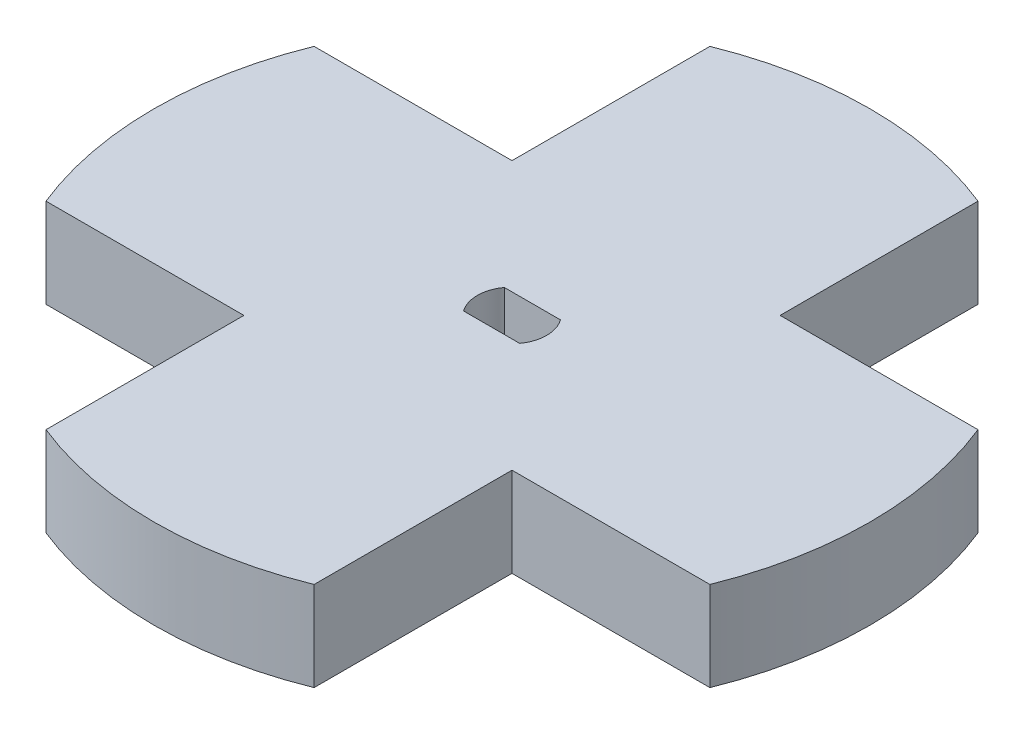
ISO-10303-21;
HEADER;
FILE_DESCRIPTION(('STEP AP214'),'2;1');
FILE_NAME('part.step','',(''),(''),'','','');
FILE_SCHEMA(('AUTOMOTIVE_DESIGN { 1 0 10303 214 1 1 1 1 }'));
ENDSEC;
DATA;
#1=APPLICATION_CONTEXT('core data for automotive mechanical design processes');
#2=APPLICATION_PROTOCOL_DEFINITION('international standard','automotive_design',2000,#1);
#3=PRODUCT_CONTEXT('',#1,'mechanical');
#4=PRODUCT('Part','Part','',(#3));
#5=PRODUCT_RELATED_PRODUCT_CATEGORY('part','',(#4));
#6=PRODUCT_DEFINITION_FORMATION('','',#4);
#7=PRODUCT_DEFINITION_CONTEXT('part definition',#1,'design');
#8=PRODUCT_DEFINITION('design','',#6,#7);
#9=PRODUCT_DEFINITION_SHAPE('','',#8);
#10=(LENGTH_UNIT() NAMED_UNIT(*) SI_UNIT(.MILLI.,.METRE.));
#11=(NAMED_UNIT(*) PLANE_ANGLE_UNIT() SI_UNIT($,.RADIAN.));
#12=(NAMED_UNIT(*) SI_UNIT($,.STERADIAN.) SOLID_ANGLE_UNIT());
#13=UNCERTAINTY_MEASURE_WITH_UNIT(LENGTH_MEASURE(1.E-05),#10,'distance_accuracy_value','');
#14=(GEOMETRIC_REPRESENTATION_CONTEXT(3) GLOBAL_UNCERTAINTY_ASSIGNED_CONTEXT((#13)) GLOBAL_UNIT_ASSIGNED_CONTEXT((#10,
#11,#12)) REPRESENTATION_CONTEXT('',''));
#15=CARTESIAN_POINT('',(0.,0.,0.));
#16=DIRECTION('',(0.,0.,1.));
#17=DIRECTION('',(1.,0.,0.));
#18=AXIS2_PLACEMENT_3D('',#15,#16,#17);
#19=CARTESIAN_POINT('',(11.6539635308884,6.35,-34.3590993755502));
#20=DIRECTION('',(0.,1.,0.));
#21=DIRECTION('',(0.,0.,1.));
#22=AXIS2_PLACEMENT_3D('',#19,#20,#21);
#23=PLANE('',#22);
#24=DIRECTION('',(-1.,0.,0.));
#25=VECTOR('',#24,1.);
#26=CARTESIAN_POINT('',(2.12896353088838,6.35,-43.8840993755502));
#27=LINE('',#26,#25);
#28=CARTESIAN_POINT('',(2.12896353088838,6.35,-43.8840993755502));
#29=VERTEX_POINT('',#28);
#30=CARTESIAN_POINT('',(-11.9335608540487,6.35,-43.8840993755502));
#31=VERTEX_POINT('',#30);
#32=EDGE_CURVE('E199',#29,#31,#27,.T.);
#33=ORIENTED_EDGE('',*,*,#32,.T.);
#34=CARTESIAN_POINT('',(11.6539635308884,6.35,-34.3590993755502));
#35=DIRECTION('',(0.,1.,0.));
#36=DIRECTION('',(0.,0.,1.));
#37=AXIS2_PLACEMENT_3D('',#34,#35,#36);
#38=CIRCLE('',#37,25.4381);
#39=CARTESIAN_POINT('',(-11.9335608540487,6.35,-24.8340993755502));
#40=VERTEX_POINT('',#39);
#41=EDGE_CURVE('E203',#31,#40,#38,.T.);
#42=ORIENTED_EDGE('',*,*,#41,.T.);
#43=DIRECTION('',(1.,0.,0.));
#44=VECTOR('',#43,1.);
#45=CARTESIAN_POINT('',(2.12896353088838,6.35,-24.8340993755502));
#46=LINE('',#45,#44);
#47=CARTESIAN_POINT('',(2.12896353088838,6.35,-24.8340993755502));
#48=VERTEX_POINT('',#47);
#49=EDGE_CURVE('E207',#40,#48,#46,.T.);
#50=ORIENTED_EDGE('',*,*,#49,.T.);
#51=DIRECTION('',(0.,0.,1.));
#52=VECTOR('',#51,1.);
#53=CARTESIAN_POINT('',(2.12896353088838,6.35,-24.8340993755502));
#54=LINE('',#53,#52);
#55=CARTESIAN_POINT('',(2.12896353088838,6.35,-10.7715749906131));
#56=VERTEX_POINT('',#55);
#57=EDGE_CURVE('E210',#48,#56,#54,.T.);
#58=ORIENTED_EDGE('',*,*,#57,.T.);
#59=CARTESIAN_POINT('',(11.6539635308884,6.35,-34.3590993755502));
#60=DIRECTION('',(0.,1.,0.));
#61=DIRECTION('',(0.,0.,1.));
#62=AXIS2_PLACEMENT_3D('',#59,#60,#61);
#63=CIRCLE('',#62,25.4381);
#64=CARTESIAN_POINT('',(21.1789635308884,6.35,-10.7715749906131));
#65=VERTEX_POINT('',#64);
#66=EDGE_CURVE('E213',#56,#65,#63,.T.);
#67=ORIENTED_EDGE('',*,*,#66,.T.);
#68=DIRECTION('',(0.,0.,-1.));
#69=VECTOR('',#68,1.);
#70=CARTESIAN_POINT('',(21.1789635308884,6.35,-24.8340993755502));
#71=LINE('',#70,#69);
#72=CARTESIAN_POINT('',(21.1789635308884,6.35,-24.8340993755502));
#73=VERTEX_POINT('',#72);
#74=EDGE_CURVE('E216',#65,#73,#71,.T.);
#75=ORIENTED_EDGE('',*,*,#74,.T.);
#76=DIRECTION('',(1.,0.,0.));
#77=VECTOR('',#76,1.);
#78=CARTESIAN_POINT('',(21.1789635308884,6.35,-24.8340993755502));
#79=LINE('',#78,#77);
#80=CARTESIAN_POINT('',(35.2414879158254,6.35,-24.8340993755502));
#81=VERTEX_POINT('',#80);
#82=EDGE_CURVE('E219',#73,#81,#79,.T.);
#83=ORIENTED_EDGE('',*,*,#82,.T.);
#84=CARTESIAN_POINT('',(11.6539635308884,6.35,-34.3590993755502));
#85=DIRECTION('',(0.,1.,0.));
#86=DIRECTION('',(0.,0.,1.));
#87=AXIS2_PLACEMENT_3D('',#84,#85,#86);
#88=CIRCLE('',#87,25.4381);
#89=CARTESIAN_POINT('',(35.2414879158254,6.35,-43.8840993755502));
#90=VERTEX_POINT('',#89);
#91=EDGE_CURVE('E222',#81,#90,#88,.T.);
#92=ORIENTED_EDGE('',*,*,#91,.T.);
#93=DIRECTION('',(-1.,0.,0.));
#94=VECTOR('',#93,1.);
#95=CARTESIAN_POINT('',(21.1789635308884,6.35,-43.8840993755502));
#96=LINE('',#95,#94);
#97=CARTESIAN_POINT('',(21.1789635308884,6.35,-43.8840993755502));
#98=VERTEX_POINT('',#97);
#99=EDGE_CURVE('E225',#90,#98,#96,.T.);
#100=ORIENTED_EDGE('',*,*,#99,.T.);
#101=DIRECTION('',(0.,0.,-1.));
#102=VECTOR('',#101,1.);
#103=CARTESIAN_POINT('',(21.1789635308884,6.35,-43.8840993755502));
#104=LINE('',#103,#102);
#105=CARTESIAN_POINT('',(21.1789635308884,6.35,-57.9466237604872));
#106=VERTEX_POINT('',#105);
#107=EDGE_CURVE('E228',#98,#106,#104,.T.);
#108=ORIENTED_EDGE('',*,*,#107,.T.);
#109=CARTESIAN_POINT('',(11.6539635308884,6.35,-34.3590993755502));
#110=DIRECTION('',(0.,1.,0.));
#111=DIRECTION('',(0.,0.,1.));
#112=AXIS2_PLACEMENT_3D('',#109,#110,#111);
#113=CIRCLE('',#112,25.4381);
#114=CARTESIAN_POINT('',(2.12896353088838,6.35,-57.9466237604872));
#115=VERTEX_POINT('',#114);
#116=EDGE_CURVE('E231',#106,#115,#113,.T.);
#117=ORIENTED_EDGE('',*,*,#116,.T.);
#118=DIRECTION('',(0.,0.,1.));
#119=VECTOR('',#118,1.);
#120=CARTESIAN_POINT('',(2.12896353088838,6.35,-43.8840993755502));
#121=LINE('',#120,#119);
#122=EDGE_CURVE('E234',#115,#29,#121,.T.);
#123=ORIENTED_EDGE('',*,*,#122,.T.);
#124=EDGE_LOOP('',(#33,#42,#50,#58,#67,#75,#83,#92,#100,#108,#117,#123));
#125=FACE_BOUND('',#124,.T.);
#126=DIRECTION('',(1.,0.,0.));
#127=VECTOR('',#126,1.);
#128=CARTESIAN_POINT('',(11.6539635308884,6.35,-32.9112993755502));
#129=LINE('',#128,#127);
#130=CARTESIAN_POINT('',(9.66042757686096,6.35,-32.9112993755502));
#131=VERTEX_POINT('',#130);
#132=CARTESIAN_POINT('',(13.6474994849158,6.35,-32.9112993755502));
#133=VERTEX_POINT('',#132);
#134=EDGE_CURVE('E171',#131,#133,#129,.T.);
#135=ORIENTED_EDGE('',*,*,#134,.F.);
#136=CARTESIAN_POINT('',(11.6539635308884,6.35,-34.3590993755502));
#137=DIRECTION('',(0.,1.,0.));
#138=DIRECTION('',(0.,0.,1.));
#139=AXIS2_PLACEMENT_3D('',#136,#137,#138);
#140=CIRCLE('',#139,2.4638);
#141=CARTESIAN_POINT('',(9.66042757686096,6.35,-35.8068993755502));
#142=VERTEX_POINT('',#141);
#143=EDGE_CURVE('E156',#142,#131,#140,.T.);
#144=ORIENTED_EDGE('',*,*,#143,.F.);
#145=DIRECTION('',(-1.,0.,0.));
#146=VECTOR('',#145,1.);
#147=CARTESIAN_POINT('',(11.6539635308884,6.35,-35.8068993755502));
#148=LINE('',#147,#146);
#149=CARTESIAN_POINT('',(13.6474994849158,6.35,-35.8068993755502));
#150=VERTEX_POINT('',#149);
#151=EDGE_CURVE('E150',#150,#142,#148,.T.);
#152=ORIENTED_EDGE('',*,*,#151,.F.);
#153=CARTESIAN_POINT('',(11.6539635308884,6.35,-34.3590993755502));
#154=DIRECTION('',(0.,1.,0.));
#155=DIRECTION('',(0.,0.,1.));
#156=AXIS2_PLACEMENT_3D('',#153,#154,#155);
#157=CIRCLE('',#156,2.4638);
#158=EDGE_CURVE('E175',#133,#150,#157,.T.);
#159=ORIENTED_EDGE('',*,*,#158,.F.);
#160=EDGE_LOOP('',(#135,#144,#152,#159));
#161=FACE_BOUND('',#160,.T.);
#162=ADVANCED_FACE('F39',(#125,#161),#23,.T.);
#163=CARTESIAN_POINT('',(11.6539635308884,0.,-34.3590993755502));
#164=DIRECTION('',(0.,1.,0.));
#165=DIRECTION('',(0.,0.,1.));
#166=AXIS2_PLACEMENT_3D('',#163,#164,#165);
#167=PLANE('',#166);
#168=DIRECTION('',(-1.,0.,0.));
#169=VECTOR('',#168,1.);
#170=CARTESIAN_POINT('',(2.12896353088838,0.,-43.8840993755502));
#171=LINE('',#170,#169);
#172=CARTESIAN_POINT('',(2.12896353088838,0.,-43.8840993755502));
#173=VERTEX_POINT('',#172);
#174=CARTESIAN_POINT('',(-11.9335608540487,0.,-43.8840993755502));
#175=VERTEX_POINT('',#174);
#176=EDGE_CURVE('E167',#173,#175,#171,.T.);
#177=ORIENTED_EDGE('',*,*,#176,.F.);
#178=DIRECTION('',(0.,0.,1.));
#179=VECTOR('',#178,1.);
#180=CARTESIAN_POINT('',(2.12896353088838,0.,-43.8840993755502));
#181=LINE('',#180,#179);
#182=CARTESIAN_POINT('',(2.12896353088838,0.,-57.9466237604872));
#183=VERTEX_POINT('',#182);
#184=EDGE_CURVE('E204',#183,#173,#181,.T.);
#185=ORIENTED_EDGE('',*,*,#184,.F.);
#186=CARTESIAN_POINT('',(11.6539635308884,0.,-34.3590993755502));
#187=DIRECTION('',(0.,1.,0.));
#188=DIRECTION('',(0.,0.,1.));
#189=AXIS2_PLACEMENT_3D('',#186,#187,#188);
#190=CIRCLE('',#189,25.4381);
#191=CARTESIAN_POINT('',(21.1789635308884,0.,-57.9466237604872));
#192=VERTEX_POINT('',#191);
#193=EDGE_CURVE('E268',#192,#183,#190,.T.);
#194=ORIENTED_EDGE('',*,*,#193,.F.);
#195=DIRECTION('',(0.,0.,-1.));
#196=VECTOR('',#195,1.);
#197=CARTESIAN_POINT('',(21.1789635308884,0.,-43.8840993755502));
#198=LINE('',#197,#196);
#199=CARTESIAN_POINT('',(21.1789635308884,0.,-43.8840993755502));
#200=VERTEX_POINT('',#199);
#201=EDGE_CURVE('E265',#200,#192,#198,.T.);
#202=ORIENTED_EDGE('',*,*,#201,.F.);
#203=DIRECTION('',(-1.,0.,0.));
#204=VECTOR('',#203,1.);
#205=CARTESIAN_POINT('',(21.1789635308884,0.,-43.8840993755502));
#206=LINE('',#205,#204);
#207=CARTESIAN_POINT('',(35.2414879158254,0.,-43.8840993755502));
#208=VERTEX_POINT('',#207);
#209=EDGE_CURVE('E262',#208,#200,#206,.T.);
#210=ORIENTED_EDGE('',*,*,#209,.F.);
#211=CARTESIAN_POINT('',(11.6539635308884,0.,-34.3590993755502));
#212=DIRECTION('',(0.,1.,0.));
#213=DIRECTION('',(0.,0.,1.));
#214=AXIS2_PLACEMENT_3D('',#211,#212,#213);
#215=CIRCLE('',#214,25.4381);
#216=CARTESIAN_POINT('',(35.2414879158254,0.,-24.8340993755502));
#217=VERTEX_POINT('',#216);
#218=EDGE_CURVE('E259',#217,#208,#215,.T.);
#219=ORIENTED_EDGE('',*,*,#218,.F.);
#220=DIRECTION('',(1.,0.,0.));
#221=VECTOR('',#220,1.);
#222=CARTESIAN_POINT('',(21.1789635308884,0.,-24.8340993755502));
#223=LINE('',#222,#221);
#224=CARTESIAN_POINT('',(21.1789635308884,0.,-24.8340993755502));
#225=VERTEX_POINT('',#224);
#226=EDGE_CURVE('E256',#225,#217,#223,.T.);
#227=ORIENTED_EDGE('',*,*,#226,.F.);
#228=DIRECTION('',(0.,0.,-1.));
#229=VECTOR('',#228,1.);
#230=CARTESIAN_POINT('',(21.1789635308884,0.,-24.8340993755502));
#231=LINE('',#230,#229);
#232=CARTESIAN_POINT('',(21.1789635308884,0.,-10.7715749906131));
#233=VERTEX_POINT('',#232);
#234=EDGE_CURVE('E253',#233,#225,#231,.T.);
#235=ORIENTED_EDGE('',*,*,#234,.F.);
#236=CARTESIAN_POINT('',(11.6539635308884,0.,-34.3590993755502));
#237=DIRECTION('',(0.,1.,0.));
#238=DIRECTION('',(0.,0.,1.));
#239=AXIS2_PLACEMENT_3D('',#236,#237,#238);
#240=CIRCLE('',#239,25.4381);
#241=CARTESIAN_POINT('',(2.12896353088838,0.,-10.7715749906131));
#242=VERTEX_POINT('',#241);
#243=EDGE_CURVE('E250',#242,#233,#240,.T.);
#244=ORIENTED_EDGE('',*,*,#243,.F.);
#245=DIRECTION('',(0.,0.,1.));
#246=VECTOR('',#245,1.);
#247=CARTESIAN_POINT('',(2.12896353088838,0.,-24.8340993755502));
#248=LINE('',#247,#246);
#249=CARTESIAN_POINT('',(2.12896353088838,0.,-24.8340993755502));
#250=VERTEX_POINT('',#249);
#251=EDGE_CURVE('E247',#250,#242,#248,.T.);
#252=ORIENTED_EDGE('',*,*,#251,.F.);
#253=DIRECTION('',(1.,0.,0.));
#254=VECTOR('',#253,1.);
#255=CARTESIAN_POINT('',(2.12896353088838,0.,-24.8340993755502));
#256=LINE('',#255,#254);
#257=CARTESIAN_POINT('',(-11.9335608540487,0.,-24.8340993755502));
#258=VERTEX_POINT('',#257);
#259=EDGE_CURVE('E244',#258,#250,#256,.T.);
#260=ORIENTED_EDGE('',*,*,#259,.F.);
#261=CARTESIAN_POINT('',(11.6539635308884,0.,-34.3590993755502));
#262=DIRECTION('',(0.,1.,0.));
#263=DIRECTION('',(0.,0.,1.));
#264=AXIS2_PLACEMENT_3D('',#261,#262,#263);
#265=CIRCLE('',#264,25.4381);
#266=EDGE_CURVE('E241',#175,#258,#265,.T.);
#267=ORIENTED_EDGE('',*,*,#266,.F.);
#268=EDGE_LOOP('',(#177,#185,#194,#202,#210,#219,#227,#235,#244,#252,#260,#267));
#269=FACE_BOUND('',#268,.T.);
#270=CARTESIAN_POINT('',(11.6539635308884,0.,-34.3590993755502));
#271=DIRECTION('',(0.,1.,0.));
#272=DIRECTION('',(0.,0.,1.));
#273=AXIS2_PLACEMENT_3D('',#270,#271,#272);
#274=CIRCLE('',#273,2.4638);
#275=CARTESIAN_POINT('',(9.66042757686096,0.,-35.8068993755502));
#276=VERTEX_POINT('',#275);
#277=CARTESIAN_POINT('',(9.66042757686096,0.,-32.9112993755502));
#278=VERTEX_POINT('',#277);
#279=EDGE_CURVE('E164',#276,#278,#274,.T.);
#280=ORIENTED_EDGE('',*,*,#279,.T.);
#281=DIRECTION('',(1.,0.,0.));
#282=VECTOR('',#281,1.);
#283=CARTESIAN_POINT('',(11.6539635308884,0.,-32.9112993755502));
#284=LINE('',#283,#282);
#285=CARTESIAN_POINT('',(13.6474994849158,0.,-32.9112993755502));
#286=VERTEX_POINT('',#285);
#287=EDGE_CURVE('E182',#278,#286,#284,.T.);
#288=ORIENTED_EDGE('',*,*,#287,.T.);
#289=CARTESIAN_POINT('',(11.6539635308884,0.,-34.3590993755502));
#290=DIRECTION('',(0.,1.,0.));
#291=DIRECTION('',(0.,0.,1.));
#292=AXIS2_PLACEMENT_3D('',#289,#290,#291);
#293=CIRCLE('',#292,2.4638);
#294=CARTESIAN_POINT('',(13.6474994849158,0.,-35.8068993755502));
#295=VERTEX_POINT('',#294);
#296=EDGE_CURVE('E186',#286,#295,#293,.T.);
#297=ORIENTED_EDGE('',*,*,#296,.T.);
#298=DIRECTION('',(-1.,0.,0.));
#299=VECTOR('',#298,1.);
#300=CARTESIAN_POINT('',(11.6539635308884,0.,-35.8068993755502));
#301=LINE('',#300,#299);
#302=EDGE_CURVE('E157',#295,#276,#301,.T.);
#303=ORIENTED_EDGE('',*,*,#302,.T.);
#304=EDGE_LOOP('',(#280,#288,#297,#303));
#305=FACE_BOUND('',#304,.T.);
#306=ADVANCED_FACE('F323',(#269,#305),#167,.F.);
#307=CARTESIAN_POINT('',(2.12896353088838,6.35,-43.8840993755502));
#308=DIRECTION('',(0.,0.,1.));
#309=DIRECTION('',(1.,0.,0.));
#310=AXIS2_PLACEMENT_3D('',#307,#308,#309);
#311=PLANE('',#310);
#312=ORIENTED_EDGE('',*,*,#176,.T.);
#313=DIRECTION('',(0.,-1.,0.));
#314=VECTOR('',#313,1.);
#315=CARTESIAN_POINT('',(-11.9335608540487,6.35,-43.8840993755502));
#316=LINE('',#315,#314);
#317=EDGE_CURVE('E11',#31,#175,#316,.T.);
#318=ORIENTED_EDGE('',*,*,#317,.F.);
#319=ORIENTED_EDGE('',*,*,#32,.F.);
#320=DIRECTION('',(0.,-1.,0.));
#321=VECTOR('',#320,1.);
#322=CARTESIAN_POINT('',(2.12896353088838,6.35,-43.8840993755502));
#323=LINE('',#322,#321);
#324=EDGE_CURVE('E237',#29,#173,#323,.T.);
#325=ORIENTED_EDGE('',*,*,#324,.T.);
#326=EDGE_LOOP('',(#312,#318,#319,#325));
#327=FACE_BOUND('',#326,.T.);
#328=ADVANCED_FACE('F41',(#327),#311,.F.);
#329=CARTESIAN_POINT('',(11.6539635308884,6.35,-34.3590993755502));
#330=DIRECTION('',(0.,-1.,0.));
#331=DIRECTION('',(0.,0.,-1.));
#332=AXIS2_PLACEMENT_3D('',#329,#330,#331);
#333=CYLINDRICAL_SURFACE('',#332,25.4381);
#334=ORIENTED_EDGE('',*,*,#266,.T.);
#335=DIRECTION('',(0.,-1.,0.));
#336=VECTOR('',#335,1.);
#337=CARTESIAN_POINT('',(-11.9335608540487,6.35,-24.8340993755502));
#338=LINE('',#337,#336);
#339=EDGE_CURVE('E48',#40,#258,#338,.T.);
#340=ORIENTED_EDGE('',*,*,#339,.F.);
#341=ORIENTED_EDGE('',*,*,#41,.F.);
#342=ORIENTED_EDGE('',*,*,#317,.T.);
#343=EDGE_LOOP('',(#334,#340,#341,#342));
#344=FACE_BOUND('',#343,.T.);
#345=ADVANCED_FACE('F340',(#344),#333,.T.);
#346=CARTESIAN_POINT('',(2.12896353088838,6.35,-24.8340993755502));
#347=DIRECTION('',(0.,0.,-1.));
#348=DIRECTION('',(-1.,0.,0.));
#349=AXIS2_PLACEMENT_3D('',#346,#347,#348);
#350=PLANE('',#349);
#351=ORIENTED_EDGE('',*,*,#259,.T.);
#352=DIRECTION('',(0.,-1.,0.));
#353=VECTOR('',#352,1.);
#354=CARTESIAN_POINT('',(2.12896353088838,6.35,-24.8340993755502));
#355=LINE('',#354,#353);
#356=EDGE_CURVE('E308',#48,#250,#355,.T.);
#357=ORIENTED_EDGE('',*,*,#356,.F.);
#358=ORIENTED_EDGE('',*,*,#49,.F.);
#359=ORIENTED_EDGE('',*,*,#339,.T.);
#360=EDGE_LOOP('',(#351,#357,#358,#359));
#361=FACE_BOUND('',#360,.T.);
#362=ADVANCED_FACE('F317',(#361),#350,.F.);
#363=CARTESIAN_POINT('',(2.12896353088838,6.35,-24.8340993755502));
#364=DIRECTION('',(1.,0.,0.));
#365=DIRECTION('',(0.,0.,-1.));
#366=AXIS2_PLACEMENT_3D('',#363,#364,#365);
#367=PLANE('',#366);
#368=ORIENTED_EDGE('',*,*,#251,.T.);
#369=DIRECTION('',(0.,-1.,0.));
#370=VECTOR('',#369,1.);
#371=CARTESIAN_POINT('',(2.12896353088838,6.35,-10.7715749906131));
#372=LINE('',#371,#370);
#373=EDGE_CURVE('E304',#56,#242,#372,.T.);
#374=ORIENTED_EDGE('',*,*,#373,.F.);
#375=ORIENTED_EDGE('',*,*,#57,.F.);
#376=ORIENTED_EDGE('',*,*,#356,.T.);
#377=EDGE_LOOP('',(#368,#374,#375,#376));
#378=FACE_BOUND('',#377,.T.);
#379=ADVANCED_FACE('F329',(#378),#367,.F.);
#380=CARTESIAN_POINT('',(11.6539635308884,6.35,-34.3590993755502));
#381=DIRECTION('',(0.,-1.,0.));
#382=DIRECTION('',(0.,0.,-1.));
#383=AXIS2_PLACEMENT_3D('',#380,#381,#382);
#384=CYLINDRICAL_SURFACE('',#383,25.4381);
#385=ORIENTED_EDGE('',*,*,#243,.T.);
#386=DIRECTION('',(0.,-1.,0.));
#387=VECTOR('',#386,1.);
#388=CARTESIAN_POINT('',(21.1789635308884,6.35,-10.7715749906131));
#389=LINE('',#388,#387);
#390=EDGE_CURVE('E300',#65,#233,#389,.T.);
#391=ORIENTED_EDGE('',*,*,#390,.F.);
#392=ORIENTED_EDGE('',*,*,#66,.F.);
#393=ORIENTED_EDGE('',*,*,#373,.T.);
#394=EDGE_LOOP('',(#385,#391,#392,#393));
#395=FACE_BOUND('',#394,.T.);
#396=ADVANCED_FACE('F333',(#395),#384,.T.);
#397=CARTESIAN_POINT('',(21.1789635308884,6.35,-24.8340993755502));
#398=DIRECTION('',(-1.,0.,0.));
#399=DIRECTION('',(0.,0.,1.));
#400=AXIS2_PLACEMENT_3D('',#397,#398,#399);
#401=PLANE('',#400);
#402=ORIENTED_EDGE('',*,*,#234,.T.);
#403=DIRECTION('',(0.,-1.,0.));
#404=VECTOR('',#403,1.);
#405=CARTESIAN_POINT('',(21.1789635308884,6.35,-24.8340993755502));
#406=LINE('',#405,#404);
#407=EDGE_CURVE('E296',#73,#225,#406,.T.);
#408=ORIENTED_EDGE('',*,*,#407,.F.);
#409=ORIENTED_EDGE('',*,*,#74,.F.);
#410=ORIENTED_EDGE('',*,*,#390,.T.);
#411=EDGE_LOOP('',(#402,#408,#409,#410));
#412=FACE_BOUND('',#411,.T.);
#413=ADVANCED_FACE('F373',(#412),#401,.F.);
#414=CARTESIAN_POINT('',(21.1789635308884,6.35,-24.8340993755502));
#415=DIRECTION('',(0.,0.,-1.));
#416=DIRECTION('',(-1.,0.,0.));
#417=AXIS2_PLACEMENT_3D('',#414,#415,#416);
#418=PLANE('',#417);
#419=ORIENTED_EDGE('',*,*,#226,.T.);
#420=DIRECTION('',(0.,-1.,0.));
#421=VECTOR('',#420,1.);
#422=CARTESIAN_POINT('',(35.2414879158254,6.35,-24.8340993755502));
#423=LINE('',#422,#421);
#424=EDGE_CURVE('E292',#81,#217,#423,.T.);
#425=ORIENTED_EDGE('',*,*,#424,.F.);
#426=ORIENTED_EDGE('',*,*,#82,.F.);
#427=ORIENTED_EDGE('',*,*,#407,.T.);
#428=EDGE_LOOP('',(#419,#425,#426,#427));
#429=FACE_BOUND('',#428,.T.);
#430=ADVANCED_FACE('F371',(#429),#418,.F.);
#431=CARTESIAN_POINT('',(11.6539635308884,6.35,-34.3590993755502));
#432=DIRECTION('',(0.,-1.,0.));
#433=DIRECTION('',(0.,0.,-1.));
#434=AXIS2_PLACEMENT_3D('',#431,#432,#433);
#435=CYLINDRICAL_SURFACE('',#434,25.4381);
#436=ORIENTED_EDGE('',*,*,#218,.T.);
#437=DIRECTION('',(0.,-1.,0.));
#438=VECTOR('',#437,1.);
#439=CARTESIAN_POINT('',(35.2414879158254,6.35,-43.8840993755502));
#440=LINE('',#439,#438);
#441=EDGE_CURVE('E288',#90,#208,#440,.T.);
#442=ORIENTED_EDGE('',*,*,#441,.F.);
#443=ORIENTED_EDGE('',*,*,#91,.F.);
#444=ORIENTED_EDGE('',*,*,#424,.T.);
#445=EDGE_LOOP('',(#436,#442,#443,#444));
#446=FACE_BOUND('',#445,.T.);
#447=ADVANCED_FACE('F367',(#446),#435,.T.);
#448=CARTESIAN_POINT('',(21.1789635308884,6.35,-43.8840993755502));
#449=DIRECTION('',(0.,0.,1.));
#450=DIRECTION('',(1.,0.,0.));
#451=AXIS2_PLACEMENT_3D('',#448,#449,#450);
#452=PLANE('',#451);
#453=ORIENTED_EDGE('',*,*,#209,.T.);
#454=DIRECTION('',(0.,-1.,0.));
#455=VECTOR('',#454,1.);
#456=CARTESIAN_POINT('',(21.1789635308884,6.35,-43.8840993755502));
#457=LINE('',#456,#455);
#458=EDGE_CURVE('E284',#98,#200,#457,.T.);
#459=ORIENTED_EDGE('',*,*,#458,.F.);
#460=ORIENTED_EDGE('',*,*,#99,.F.);
#461=ORIENTED_EDGE('',*,*,#441,.T.);
#462=EDGE_LOOP('',(#453,#459,#460,#461));
#463=FACE_BOUND('',#462,.T.);
#464=ADVANCED_FACE('F362',(#463),#452,.F.);
#465=CARTESIAN_POINT('',(21.1789635308884,6.35,-43.8840993755502));
#466=DIRECTION('',(-1.,0.,0.));
#467=DIRECTION('',(0.,0.,1.));
#468=AXIS2_PLACEMENT_3D('',#465,#466,#467);
#469=PLANE('',#468);
#470=ORIENTED_EDGE('',*,*,#201,.T.);
#471=DIRECTION('',(0.,-1.,0.));
#472=VECTOR('',#471,1.);
#473=CARTESIAN_POINT('',(21.1789635308884,6.35,-57.9466237604872));
#474=LINE('',#473,#472);
#475=EDGE_CURVE('E280',#106,#192,#474,.T.);
#476=ORIENTED_EDGE('',*,*,#475,.F.);
#477=ORIENTED_EDGE('',*,*,#107,.F.);
#478=ORIENTED_EDGE('',*,*,#458,.T.);
#479=EDGE_LOOP('',(#470,#476,#477,#478));
#480=FACE_BOUND('',#479,.T.);
#481=ADVANCED_FACE('F356',(#480),#469,.F.);
#482=CARTESIAN_POINT('',(11.6539635308884,6.35,-34.3590993755502));
#483=DIRECTION('',(0.,-1.,0.));
#484=DIRECTION('',(0.,0.,-1.));
#485=AXIS2_PLACEMENT_3D('',#482,#483,#484);
#486=CYLINDRICAL_SURFACE('',#485,25.4381);
#487=ORIENTED_EDGE('',*,*,#193,.T.);
#488=DIRECTION('',(0.,-1.,0.));
#489=VECTOR('',#488,1.);
#490=CARTESIAN_POINT('',(2.12896353088838,6.35,-57.9466237604872));
#491=LINE('',#490,#489);
#492=EDGE_CURVE('E276',#115,#183,#491,.T.);
#493=ORIENTED_EDGE('',*,*,#492,.F.);
#494=ORIENTED_EDGE('',*,*,#116,.F.);
#495=ORIENTED_EDGE('',*,*,#475,.T.);
#496=EDGE_LOOP('',(#487,#493,#494,#495));
#497=FACE_BOUND('',#496,.T.);
#498=ADVANCED_FACE('F352',(#497),#486,.T.);
#499=CARTESIAN_POINT('',(2.12896353088838,6.35,-43.8840993755502));
#500=DIRECTION('',(1.,0.,0.));
#501=DIRECTION('',(0.,0.,-1.));
#502=AXIS2_PLACEMENT_3D('',#499,#500,#501);
#503=PLANE('',#502);
#504=ORIENTED_EDGE('',*,*,#184,.T.);
#505=ORIENTED_EDGE('',*,*,#324,.F.);
#506=ORIENTED_EDGE('',*,*,#122,.F.);
#507=ORIENTED_EDGE('',*,*,#492,.T.);
#508=EDGE_LOOP('',(#504,#505,#506,#507));
#509=FACE_BOUND('',#508,.T.);
#510=ADVANCED_FACE('F347',(#509),#503,.F.);
#511=CARTESIAN_POINT('',(11.6539635308884,6.35,-34.3590993755502));
#512=DIRECTION('',(0.,-1.,0.));
#513=DIRECTION('',(0.,0.,-1.));
#514=AXIS2_PLACEMENT_3D('',#511,#512,#513);
#515=CYLINDRICAL_SURFACE('',#514,2.4638);
#516=ORIENTED_EDGE('',*,*,#279,.F.);
#517=DIRECTION('',(0.,-1.,0.));
#518=VECTOR('',#517,1.);
#519=CARTESIAN_POINT('',(9.66042757686096,6.35,-35.8068993755502));
#520=LINE('',#519,#518);
#521=EDGE_CURVE('E60',#142,#276,#520,.T.);
#522=ORIENTED_EDGE('',*,*,#521,.F.);
#523=ORIENTED_EDGE('',*,*,#143,.T.);
#524=DIRECTION('',(0.,-1.,0.));
#525=VECTOR('',#524,1.);
#526=CARTESIAN_POINT('',(9.66042757686096,6.35,-32.9112993755502));
#527=LINE('',#526,#525);
#528=EDGE_CURVE('E168',#131,#278,#527,.T.);
#529=ORIENTED_EDGE('',*,*,#528,.T.);
#530=EDGE_LOOP('',(#516,#522,#523,#529));
#531=FACE_BOUND('',#530,.T.);
#532=ADVANCED_FACE('F160',(#531),#515,.F.);
#533=CARTESIAN_POINT('',(11.6539635308884,6.35,-32.9112993755502));
#534=DIRECTION('',(0.,0.,-1.));
#535=DIRECTION('',(-1.,0.,0.));
#536=AXIS2_PLACEMENT_3D('',#533,#534,#535);
#537=PLANE('',#536);
#538=ORIENTED_EDGE('',*,*,#287,.F.);
#539=ORIENTED_EDGE('',*,*,#528,.F.);
#540=ORIENTED_EDGE('',*,*,#134,.T.);
#541=DIRECTION('',(0.,-1.,0.));
#542=VECTOR('',#541,1.);
#543=CARTESIAN_POINT('',(13.6474994849158,6.35,-32.9112993755502));
#544=LINE('',#543,#542);
#545=EDGE_CURVE('E194',#133,#286,#544,.T.);
#546=ORIENTED_EDGE('',*,*,#545,.T.);
#547=EDGE_LOOP('',(#538,#539,#540,#546));
#548=FACE_BOUND('',#547,.T.);
#549=ADVANCED_FACE('F426',(#548),#537,.T.);
#550=CARTESIAN_POINT('',(11.6539635308884,6.35,-34.3590993755502));
#551=DIRECTION('',(0.,-1.,0.));
#552=DIRECTION('',(0.,0.,-1.));
#553=AXIS2_PLACEMENT_3D('',#550,#551,#552);
#554=CYLINDRICAL_SURFACE('',#553,2.4638);
#555=ORIENTED_EDGE('',*,*,#296,.F.);
#556=ORIENTED_EDGE('',*,*,#545,.F.);
#557=ORIENTED_EDGE('',*,*,#158,.T.);
#558=DIRECTION('',(0.,-1.,0.));
#559=VECTOR('',#558,1.);
#560=CARTESIAN_POINT('',(13.6474994849158,6.35,-35.8068993755502));
#561=LINE('',#560,#559);
#562=EDGE_CURVE('E55',#150,#295,#561,.T.);
#563=ORIENTED_EDGE('',*,*,#562,.T.);
#564=EDGE_LOOP('',(#555,#556,#557,#563));
#565=FACE_BOUND('',#564,.T.);
#566=ADVANCED_FACE('F432',(#565),#554,.F.);
#567=CARTESIAN_POINT('',(11.6539635308884,6.35,-35.8068993755502));
#568=DIRECTION('',(0.,0.,1.));
#569=DIRECTION('',(1.,0.,0.));
#570=AXIS2_PLACEMENT_3D('',#567,#568,#569);
#571=PLANE('',#570);
#572=ORIENTED_EDGE('',*,*,#302,.F.);
#573=ORIENTED_EDGE('',*,*,#562,.F.);
#574=ORIENTED_EDGE('',*,*,#151,.T.);
#575=ORIENTED_EDGE('',*,*,#521,.T.);
#576=EDGE_LOOP('',(#572,#573,#574,#575));
#577=FACE_BOUND('',#576,.T.);
#578=ADVANCED_FACE('F151',(#577),#571,.T.);
#579=CLOSED_SHELL('',(#162,#306,#328,#345,#362,#379,#396,#413,#430,#447,#464,#481,#498,#510,
#532,#549,#566,#578));
#580=MANIFOLD_SOLID_BREP('B2',#579);
#581=ADVANCED_BREP_SHAPE_REPRESENTATION('',(#18,#580),#14);
#582=SHAPE_DEFINITION_REPRESENTATION(#9,#581);
ENDSEC;
END-ISO-10303-21;
